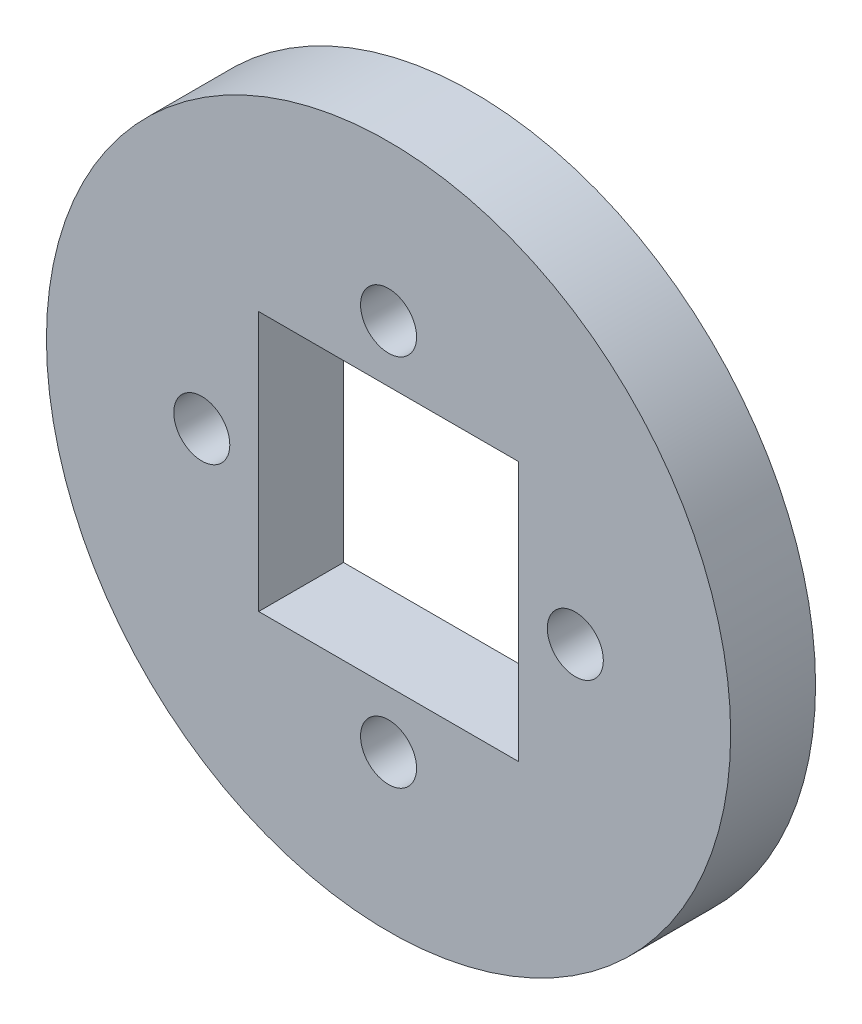
ISO-10303-21;
HEADER;
FILE_DESCRIPTION(('STEP AP214'),'2;1');
FILE_NAME('part.step','',(''),(''),'','','');
FILE_SCHEMA(('AUTOMOTIVE_DESIGN { 1 0 10303 214 1 1 1 1 }'));
ENDSEC;
DATA;
#1=APPLICATION_CONTEXT('core data for automotive mechanical design processes');
#2=APPLICATION_PROTOCOL_DEFINITION('international standard','automotive_design',2000,#1);
#3=PRODUCT_CONTEXT('',#1,'mechanical');
#4=PRODUCT('Part','Part','',(#3));
#5=PRODUCT_RELATED_PRODUCT_CATEGORY('part','',(#4));
#6=PRODUCT_DEFINITION_FORMATION('','',#4);
#7=PRODUCT_DEFINITION_CONTEXT('part definition',#1,'design');
#8=PRODUCT_DEFINITION('design','',#6,#7);
#9=PRODUCT_DEFINITION_SHAPE('','',#8);
#10=(LENGTH_UNIT() NAMED_UNIT(*) SI_UNIT(.MILLI.,.METRE.));
#11=(NAMED_UNIT(*) PLANE_ANGLE_UNIT() SI_UNIT($,.RADIAN.));
#12=(NAMED_UNIT(*) SI_UNIT($,.STERADIAN.) SOLID_ANGLE_UNIT());
#13=UNCERTAINTY_MEASURE_WITH_UNIT(LENGTH_MEASURE(1.E-05),#10,'distance_accuracy_value','');
#14=(GEOMETRIC_REPRESENTATION_CONTEXT(3) GLOBAL_UNCERTAINTY_ASSIGNED_CONTEXT((#13)) GLOBAL_UNIT_ASSIGNED_CONTEXT((#10,
#11,#12)) REPRESENTATION_CONTEXT('',''));
#15=CARTESIAN_POINT('',(0.,0.,0.));
#16=DIRECTION('',(0.,0.,1.));
#17=DIRECTION('',(1.,0.,0.));
#18=AXIS2_PLACEMENT_3D('',#15,#16,#17);
#19=CARTESIAN_POINT('',(-6.10893576505987E-13,22.0000000000008,10.));
#20=DIRECTION('',(0.,0.,-1.));
#21=DIRECTION('',(-1.,0.,0.));
#22=AXIS2_PLACEMENT_3D('',#19,#20,#21);
#23=CYLINDRICAL_SURFACE('',#22,1.65000000000054);
#24=CARTESIAN_POINT('',(-6.10893576505987E-13,22.0000000000008,0.));
#25=DIRECTION('',(0.,0.,1.));
#26=DIRECTION('',(1.,0.,0.));
#27=AXIS2_PLACEMENT_3D('',#24,#25,#26);
#28=CIRCLE('',#27,1.65000000000054);
#29=CARTESIAN_POINT('',(1.64999999999993,22.0000000000008,0.));
#30=VERTEX_POINT('',#29);
#31=EDGE_CURVE('E108',#30,#30,#28,.T.);
#32=ORIENTED_EDGE('',*,*,#31,.F.);
#33=EDGE_LOOP('',(#32));
#34=FACE_BOUND('',#33,.T.);
#35=CARTESIAN_POINT('',(-6.10893576505987E-13,22.0000000000008,4.));
#36=DIRECTION('',(0.,0.,1.));
#37=DIRECTION('',(1.,0.,0.));
#38=AXIS2_PLACEMENT_3D('',#35,#36,#37);
#39=CIRCLE('',#38,1.65000000000054);
#40=CARTESIAN_POINT('',(1.64999999999993,22.0000000000008,4.));
#41=VERTEX_POINT('',#40);
#42=EDGE_CURVE('E41',#41,#41,#39,.T.);
#43=ORIENTED_EDGE('',*,*,#42,.T.);
#44=EDGE_LOOP('',(#43));
#45=FACE_BOUND('',#44,.T.);
#46=ADVANCED_FACE('F37',(#34,#45),#23,.F.);
#47=CARTESIAN_POINT('',(21.9999999999991,7.89137852286181E-13,10.));
#48=DIRECTION('',(0.,0.,-1.));
#49=DIRECTION('',(-1.,0.,0.));
#50=AXIS2_PLACEMENT_3D('',#47,#48,#49);
#51=CYLINDRICAL_SURFACE('',#50,1.65000000000057);
#52=CARTESIAN_POINT('',(21.9999999999991,7.89137852286181E-13,0.));
#53=DIRECTION('',(0.,0.,1.));
#54=DIRECTION('',(1.,0.,0.));
#55=AXIS2_PLACEMENT_3D('',#52,#53,#54);
#56=CIRCLE('',#55,1.65000000000057);
#57=CARTESIAN_POINT('',(23.6499999999997,7.89137852286181E-13,0.));
#58=VERTEX_POINT('',#57);
#59=EDGE_CURVE('E140',#58,#58,#56,.T.);
#60=ORIENTED_EDGE('',*,*,#59,.F.);
#61=EDGE_LOOP('',(#60));
#62=FACE_BOUND('',#61,.T.);
#63=CARTESIAN_POINT('',(21.9999999999991,7.89137852286181E-13,4.));
#64=DIRECTION('',(0.,0.,1.));
#65=DIRECTION('',(1.,0.,0.));
#66=AXIS2_PLACEMENT_3D('',#63,#64,#65);
#67=CIRCLE('',#66,1.65000000000057);
#68=CARTESIAN_POINT('',(23.6499999999997,7.89137852286181E-13,4.));
#69=VERTEX_POINT('',#68);
#70=EDGE_CURVE('E126',#69,#69,#67,.T.);
#71=ORIENTED_EDGE('',*,*,#70,.T.);
#72=EDGE_LOOP('',(#71));
#73=FACE_BOUND('',#72,.T.);
#74=ADVANCED_FACE('F154',(#62,#73),#51,.F.);
#75=CARTESIAN_POINT('',(-9.59666275445163E-13,-21.9999999999992,10.));
#76=DIRECTION('',(0.,0.,-1.));
#77=DIRECTION('',(-1.,0.,0.));
#78=AXIS2_PLACEMENT_3D('',#75,#76,#77);
#79=CYLINDRICAL_SURFACE('',#78,1.65000000000059);
#80=CARTESIAN_POINT('',(-9.59666275445163E-13,-21.9999999999992,0.));
#81=DIRECTION('',(0.,0.,1.));
#82=DIRECTION('',(1.,0.,0.));
#83=AXIS2_PLACEMENT_3D('',#80,#81,#82);
#84=CIRCLE('',#83,1.65000000000059);
#85=CARTESIAN_POINT('',(1.64999999999963,-21.9999999999992,0.));
#86=VERTEX_POINT('',#85);
#87=EDGE_CURVE('E135',#86,#86,#84,.T.);
#88=ORIENTED_EDGE('',*,*,#87,.F.);
#89=EDGE_LOOP('',(#88));
#90=FACE_BOUND('',#89,.T.);
#91=CARTESIAN_POINT('',(-9.59666275445163E-13,-21.9999999999992,4.));
#92=DIRECTION('',(0.,0.,1.));
#93=DIRECTION('',(1.,0.,0.));
#94=AXIS2_PLACEMENT_3D('',#91,#92,#93);
#95=CIRCLE('',#94,1.65000000000059);
#96=CARTESIAN_POINT('',(1.64999999999963,-21.9999999999992,4.));
#97=VERTEX_POINT('',#96);
#98=EDGE_CURVE('E123',#97,#97,#95,.T.);
#99=ORIENTED_EDGE('',*,*,#98,.T.);
#100=EDGE_LOOP('',(#99));
#101=FACE_BOUND('',#100,.T.);
#102=ADVANCED_FACE('F159',(#90,#101),#79,.F.);
#103=CARTESIAN_POINT('',(-22.0000000000009,9.8428537231626E-13,10.));
#104=DIRECTION('',(0.,0.,-1.));
#105=DIRECTION('',(-1.,0.,0.));
#106=AXIS2_PLACEMENT_3D('',#103,#104,#105);
#107=CYLINDRICAL_SURFACE('',#106,1.65000000000055);
#108=CARTESIAN_POINT('',(-22.0000000000009,9.8428537231626E-13,0.));
#109=DIRECTION('',(0.,0.,1.));
#110=DIRECTION('',(1.,0.,0.));
#111=AXIS2_PLACEMENT_3D('',#108,#109,#110);
#112=CIRCLE('',#111,1.65000000000055);
#113=CARTESIAN_POINT('',(-20.3500000000003,9.8428537231626E-13,0.));
#114=VERTEX_POINT('',#113);
#115=EDGE_CURVE('E131',#114,#114,#112,.T.);
#116=ORIENTED_EDGE('',*,*,#115,.F.);
#117=EDGE_LOOP('',(#116));
#118=FACE_BOUND('',#117,.T.);
#119=CARTESIAN_POINT('',(-22.0000000000009,9.8428537231626E-13,4.));
#120=DIRECTION('',(0.,0.,1.));
#121=DIRECTION('',(1.,0.,0.));
#122=AXIS2_PLACEMENT_3D('',#119,#120,#121);
#123=CIRCLE('',#122,1.65000000000055);
#124=CARTESIAN_POINT('',(-20.3500000000003,9.8428537231626E-13,4.));
#125=VERTEX_POINT('',#124);
#126=EDGE_CURVE('E120',#125,#125,#123,.T.);
#127=ORIENTED_EDGE('',*,*,#126,.T.);
#128=EDGE_LOOP('',(#127));
#129=FACE_BOUND('',#128,.T.);
#130=ADVANCED_FACE('F177',(#118,#129),#107,.F.);
#131=CARTESIAN_POINT('',(-3.88578058618805E-13,0.,10.));
#132=DIRECTION('',(0.,0.,1.));
#133=DIRECTION('',(1.,0.,0.));
#134=AXIS2_PLACEMENT_3D('',#131,#132,#133);
#135=PLANE('',#134);
#136=CARTESIAN_POINT('',(21.9999999999991,7.89137852286181E-13,10.));
#137=DIRECTION('',(0.,0.,1.));
#138=DIRECTION('',(1.,0.,0.));
#139=AXIS2_PLACEMENT_3D('',#136,#137,#138);
#140=CIRCLE('',#139,3.30000000000057);
#141=CARTESIAN_POINT('',(25.2999999999997,7.89137852286181E-13,10.));
#142=VERTEX_POINT('',#141);
#143=EDGE_CURVE('E394',#142,#142,#140,.T.);
#144=ORIENTED_EDGE('',*,*,#143,.F.);
#145=EDGE_LOOP('',(#144));
#146=FACE_BOUND('',#145,.T.);
#147=CARTESIAN_POINT('',(-6.10893576505987E-13,22.0000000000008,10.));
#148=DIRECTION('',(0.,0.,1.));
#149=DIRECTION('',(1.,0.,0.));
#150=AXIS2_PLACEMENT_3D('',#147,#148,#149);
#151=CIRCLE('',#150,3.30000000000055);
#152=CARTESIAN_POINT('',(3.29999999999993,22.0000000000008,10.));
#153=VERTEX_POINT('',#152);
#154=EDGE_CURVE('E391',#153,#153,#151,.T.);
#155=ORIENTED_EDGE('',*,*,#154,.F.);
#156=EDGE_LOOP('',(#155));
#157=FACE_BOUND('',#156,.T.);
#158=CARTESIAN_POINT('',(-22.0000000000009,9.8428537231626E-13,10.));
#159=DIRECTION('',(0.,0.,1.));
#160=DIRECTION('',(1.,0.,0.));
#161=AXIS2_PLACEMENT_3D('',#158,#159,#160);
#162=CIRCLE('',#161,3.30000000000056);
#163=CARTESIAN_POINT('',(-18.7000000000003,9.8428537231626E-13,10.));
#164=VERTEX_POINT('',#163);
#165=EDGE_CURVE('E381',#164,#164,#162,.T.);
#166=ORIENTED_EDGE('',*,*,#165,.F.);
#167=EDGE_LOOP('',(#166));
#168=FACE_BOUND('',#167,.T.);
#169=CARTESIAN_POINT('',(-9.59666275445163E-13,-21.9999999999992,10.));
#170=DIRECTION('',(0.,0.,1.));
#171=DIRECTION('',(1.,0.,0.));
#172=AXIS2_PLACEMENT_3D('',#169,#170,#171);
#173=CIRCLE('',#172,3.30000000000059);
#174=CARTESIAN_POINT('',(3.29999999999963,-21.9999999999992,10.));
#175=VERTEX_POINT('',#174);
#176=EDGE_CURVE('E382',#175,#175,#173,.T.);
#177=ORIENTED_EDGE('',*,*,#176,.F.);
#178=EDGE_LOOP('',(#177));
#179=FACE_BOUND('',#178,.T.);
#180=CARTESIAN_POINT('',(-3.88578058618805E-13,0.,10.));
#181=DIRECTION('',(0.,0.,1.));
#182=DIRECTION('',(1.,0.,0.));
#183=AXIS2_PLACEMENT_3D('',#180,#181,#182);
#184=CIRCLE('',#183,40.3000000000004);
#185=CARTESIAN_POINT('',(40.3,0.,10.));
#186=VERTEX_POINT('',#185);
#187=EDGE_CURVE('E11',#186,#186,#184,.T.);
#188=ORIENTED_EDGE('',*,*,#187,.T.);
#189=EDGE_LOOP('',(#188));
#190=FACE_BOUND('',#189,.T.);
#191=DIRECTION('',(0.,-1.,0.));
#192=VECTOR('',#191,1.);
#193=CARTESIAN_POINT('',(-15.3000000000009,15.3000000000008,10.));
#194=LINE('',#193,#192);
#195=CARTESIAN_POINT('',(-15.3000000000009,15.3000000000008,10.));
#196=VERTEX_POINT('',#195);
#197=CARTESIAN_POINT('',(-15.3000000000009,-15.2999999999992,10.));
#198=VERTEX_POINT('',#197);
#199=EDGE_CURVE('E88',#196,#198,#194,.T.);
#200=ORIENTED_EDGE('',*,*,#199,.F.);
#201=DIRECTION('',(-1.,0.,0.));
#202=VECTOR('',#201,1.);
#203=CARTESIAN_POINT('',(15.2999999999991,15.3000000000008,10.));
#204=LINE('',#203,#202);
#205=CARTESIAN_POINT('',(15.2999999999991,15.3000000000008,10.));
#206=VERTEX_POINT('',#205);
#207=EDGE_CURVE('E80',#206,#196,#204,.T.);
#208=ORIENTED_EDGE('',*,*,#207,.F.);
#209=DIRECTION('',(0.,1.,0.));
#210=VECTOR('',#209,1.);
#211=CARTESIAN_POINT('',(15.2999999999991,-15.2999999999992,10.));
#212=LINE('',#211,#210);
#213=CARTESIAN_POINT('',(15.2999999999991,-15.2999999999992,10.));
#214=VERTEX_POINT('',#213);
#215=EDGE_CURVE('E102',#214,#206,#212,.T.);
#216=ORIENTED_EDGE('',*,*,#215,.F.);
#217=DIRECTION('',(1.,0.,0.));
#218=VECTOR('',#217,1.);
#219=CARTESIAN_POINT('',(-15.3000000000009,-15.2999999999992,10.));
#220=LINE('',#219,#218);
#221=EDGE_CURVE('E100',#198,#214,#220,.T.);
#222=ORIENTED_EDGE('',*,*,#221,.F.);
#223=EDGE_LOOP('',(#200,#208,#216,#222));
#224=FACE_BOUND('',#223,.T.);
#225=ADVANCED_FACE('F99',(#146,#157,#168,#179,#190,#224),#135,.T.);
#226=CARTESIAN_POINT('',(-3.88578058618805E-13,0.,0.));
#227=DIRECTION('',(0.,0.,1.));
#228=DIRECTION('',(1.,0.,0.));
#229=AXIS2_PLACEMENT_3D('',#226,#227,#228);
#230=PLANE('',#229);
#231=CARTESIAN_POINT('',(-3.88578058618805E-13,0.,0.));
#232=DIRECTION('',(0.,0.,1.));
#233=DIRECTION('',(1.,0.,0.));
#234=AXIS2_PLACEMENT_3D('',#231,#232,#233);
#235=CIRCLE('',#234,40.3000000000004);
#236=CARTESIAN_POINT('',(40.3,0.,0.));
#237=VERTEX_POINT('',#236);
#238=EDGE_CURVE('E46',#237,#237,#235,.T.);
#239=ORIENTED_EDGE('',*,*,#238,.F.);
#240=EDGE_LOOP('',(#239));
#241=FACE_BOUND('',#240,.T.);
#242=DIRECTION('',(-1.,0.,0.));
#243=VECTOR('',#242,1.);
#244=CARTESIAN_POINT('',(15.2999999999991,15.3000000000008,0.));
#245=LINE('',#244,#243);
#246=CARTESIAN_POINT('',(15.2999999999991,15.3000000000008,0.));
#247=VERTEX_POINT('',#246);
#248=CARTESIAN_POINT('',(-15.3000000000009,15.3000000000008,0.));
#249=VERTEX_POINT('',#248);
#250=EDGE_CURVE('E62',#247,#249,#245,.T.);
#251=ORIENTED_EDGE('',*,*,#250,.T.);
#252=DIRECTION('',(0.,-1.,0.));
#253=VECTOR('',#252,1.);
#254=CARTESIAN_POINT('',(-15.3000000000009,15.3000000000008,0.));
#255=LINE('',#254,#253);
#256=CARTESIAN_POINT('',(-15.3000000000009,-15.2999999999992,0.));
#257=VERTEX_POINT('',#256);
#258=EDGE_CURVE('E95',#249,#257,#255,.T.);
#259=ORIENTED_EDGE('',*,*,#258,.T.);
#260=DIRECTION('',(1.,0.,0.));
#261=VECTOR('',#260,1.);
#262=CARTESIAN_POINT('',(-15.3000000000009,-15.2999999999992,0.));
#263=LINE('',#262,#261);
#264=CARTESIAN_POINT('',(15.2999999999991,-15.2999999999992,0.));
#265=VERTEX_POINT('',#264);
#266=EDGE_CURVE('E110',#257,#265,#263,.T.);
#267=ORIENTED_EDGE('',*,*,#266,.T.);
#268=DIRECTION('',(0.,1.,0.));
#269=VECTOR('',#268,1.);
#270=CARTESIAN_POINT('',(15.2999999999991,-15.2999999999992,0.));
#271=LINE('',#270,#269);
#272=EDGE_CURVE('E89',#265,#247,#271,.T.);
#273=ORIENTED_EDGE('',*,*,#272,.T.);
#274=EDGE_LOOP('',(#251,#259,#267,#273));
#275=FACE_BOUND('',#274,.T.);
#276=ORIENTED_EDGE('',*,*,#31,.T.);
#277=EDGE_LOOP('',(#276));
#278=FACE_BOUND('',#277,.T.);
#279=ORIENTED_EDGE('',*,*,#59,.T.);
#280=EDGE_LOOP('',(#279));
#281=FACE_BOUND('',#280,.T.);
#282=ORIENTED_EDGE('',*,*,#87,.T.);
#283=EDGE_LOOP('',(#282));
#284=FACE_BOUND('',#283,.T.);
#285=ORIENTED_EDGE('',*,*,#115,.T.);
#286=EDGE_LOOP('',(#285));
#287=FACE_BOUND('',#286,.T.);
#288=ADVANCED_FACE('F150',(#241,#275,#278,#281,#284,#287),#230,.F.);
#289=CARTESIAN_POINT('',(-3.88578058618805E-13,0.,10.));
#290=DIRECTION('',(0.,0.,-1.));
#291=DIRECTION('',(-1.,0.,0.));
#292=AXIS2_PLACEMENT_3D('',#289,#290,#291);
#293=CYLINDRICAL_SURFACE('',#292,40.3000000000004);
#294=ORIENTED_EDGE('',*,*,#187,.F.);
#295=EDGE_LOOP('',(#294));
#296=FACE_BOUND('',#295,.T.);
#297=ORIENTED_EDGE('',*,*,#238,.T.);
#298=EDGE_LOOP('',(#297));
#299=FACE_BOUND('',#298,.T.);
#300=ADVANCED_FACE('F39',(#296,#299),#293,.T.);
#301=CARTESIAN_POINT('',(15.2999999999991,15.3000000000008,10.));
#302=DIRECTION('',(0.,-1.,0.));
#303=DIRECTION('',(1.,0.,0.));
#304=AXIS2_PLACEMENT_3D('',#301,#302,#303);
#305=PLANE('',#304);
#306=ORIENTED_EDGE('',*,*,#250,.F.);
#307=DIRECTION('',(0.,0.,-1.));
#308=VECTOR('',#307,1.);
#309=CARTESIAN_POINT('',(15.2999999999991,15.3000000000008,10.));
#310=LINE('',#309,#308);
#311=EDGE_CURVE('E84',#206,#247,#310,.T.);
#312=ORIENTED_EDGE('',*,*,#311,.F.);
#313=ORIENTED_EDGE('',*,*,#207,.T.);
#314=DIRECTION('',(0.,0.,-1.));
#315=VECTOR('',#314,1.);
#316=CARTESIAN_POINT('',(-15.3000000000009,15.3000000000008,10.));
#317=LINE('',#316,#315);
#318=EDGE_CURVE('E83',#196,#249,#317,.T.);
#319=ORIENTED_EDGE('',*,*,#318,.T.);
#320=EDGE_LOOP('',(#306,#312,#313,#319));
#321=FACE_BOUND('',#320,.T.);
#322=ADVANCED_FACE('F82',(#321),#305,.T.);
#323=CARTESIAN_POINT('',(-15.3000000000009,15.3000000000008,10.));
#324=DIRECTION('',(1.,0.,0.));
#325=DIRECTION('',(0.,1.,0.));
#326=AXIS2_PLACEMENT_3D('',#323,#324,#325);
#327=PLANE('',#326);
#328=ORIENTED_EDGE('',*,*,#258,.F.);
#329=ORIENTED_EDGE('',*,*,#318,.F.);
#330=ORIENTED_EDGE('',*,*,#199,.T.);
#331=DIRECTION('',(0.,0.,-1.));
#332=VECTOR('',#331,1.);
#333=CARTESIAN_POINT('',(-15.3000000000009,-15.2999999999992,10.));
#334=LINE('',#333,#332);
#335=EDGE_CURVE('E96',#198,#257,#334,.T.);
#336=ORIENTED_EDGE('',*,*,#335,.T.);
#337=EDGE_LOOP('',(#328,#329,#330,#336));
#338=FACE_BOUND('',#337,.T.);
#339=ADVANCED_FACE('F92',(#338),#327,.T.);
#340=CARTESIAN_POINT('',(-15.3000000000009,-15.2999999999992,10.));
#341=DIRECTION('',(0.,1.,0.));
#342=DIRECTION('',(-1.,0.,0.));
#343=AXIS2_PLACEMENT_3D('',#340,#341,#342);
#344=PLANE('',#343);
#345=ORIENTED_EDGE('',*,*,#266,.F.);
#346=ORIENTED_EDGE('',*,*,#335,.F.);
#347=ORIENTED_EDGE('',*,*,#221,.T.);
#348=DIRECTION('',(0.,0.,-1.));
#349=VECTOR('',#348,1.);
#350=CARTESIAN_POINT('',(15.2999999999991,-15.2999999999992,10.));
#351=LINE('',#350,#349);
#352=EDGE_CURVE('E54',#214,#265,#351,.T.);
#353=ORIENTED_EDGE('',*,*,#352,.T.);
#354=EDGE_LOOP('',(#345,#346,#347,#353));
#355=FACE_BOUND('',#354,.T.);
#356=ADVANCED_FACE('F168',(#355),#344,.T.);
#357=CARTESIAN_POINT('',(15.2999999999991,-15.2999999999992,10.));
#358=DIRECTION('',(-1.,0.,0.));
#359=DIRECTION('',(0.,-1.,0.));
#360=AXIS2_PLACEMENT_3D('',#357,#358,#359);
#361=PLANE('',#360);
#362=ORIENTED_EDGE('',*,*,#272,.F.);
#363=ORIENTED_EDGE('',*,*,#352,.F.);
#364=ORIENTED_EDGE('',*,*,#215,.T.);
#365=ORIENTED_EDGE('',*,*,#311,.T.);
#366=EDGE_LOOP('',(#362,#363,#364,#365));
#367=FACE_BOUND('',#366,.T.);
#368=ADVANCED_FACE('F164',(#367),#361,.T.);
#369=CARTESIAN_POINT('',(-22.0000000000009,9.8428537231626E-13,4.));
#370=DIRECTION('',(0.,0.,1.));
#371=DIRECTION('',(1.,0.,0.));
#372=AXIS2_PLACEMENT_3D('',#369,#370,#371);
#373=CYLINDRICAL_SURFACE('',#372,3.30000000000056);
#374=CARTESIAN_POINT('',(-22.0000000000009,9.8428537231626E-13,4.));
#375=DIRECTION('',(0.,0.,1.));
#376=DIRECTION('',(1.,0.,0.));
#377=AXIS2_PLACEMENT_3D('',#374,#375,#376);
#378=CIRCLE('',#377,3.30000000000056);
#379=CARTESIAN_POINT('',(-18.7000000000003,9.8428537231626E-13,4.));
#380=VERTEX_POINT('',#379);
#381=EDGE_CURVE('E380',#380,#380,#378,.T.);
#382=ORIENTED_EDGE('',*,*,#381,.F.);
#383=EDGE_LOOP('',(#382));
#384=FACE_BOUND('',#383,.T.);
#385=ORIENTED_EDGE('',*,*,#165,.T.);
#386=EDGE_LOOP('',(#385));
#387=FACE_BOUND('',#386,.T.);
#388=ADVANCED_FACE('F167',(#384,#387),#373,.F.);
#389=CARTESIAN_POINT('',(-22.0000000000009,9.8428537231626E-13,4.));
#390=DIRECTION('',(0.,0.,1.));
#391=DIRECTION('',(1.,0.,0.));
#392=AXIS2_PLACEMENT_3D('',#389,#390,#391);
#393=PLANE('',#392);
#394=ORIENTED_EDGE('',*,*,#126,.F.);
#395=EDGE_LOOP('',(#394));
#396=FACE_BOUND('',#395,.T.);
#397=ORIENTED_EDGE('',*,*,#381,.T.);
#398=EDGE_LOOP('',(#397));
#399=FACE_BOUND('',#398,.T.);
#400=ADVANCED_FACE('F215',(#396,#399),#393,.T.);
#401=CARTESIAN_POINT('',(-9.59666275445163E-13,-21.9999999999992,4.));
#402=DIRECTION('',(0.,0.,1.));
#403=DIRECTION('',(1.,0.,0.));
#404=AXIS2_PLACEMENT_3D('',#401,#402,#403);
#405=CYLINDRICAL_SURFACE('',#404,3.30000000000059);
#406=CARTESIAN_POINT('',(-9.59666275445163E-13,-21.9999999999992,4.));
#407=DIRECTION('',(0.,0.,1.));
#408=DIRECTION('',(1.,0.,0.));
#409=AXIS2_PLACEMENT_3D('',#406,#407,#408);
#410=CIRCLE('',#409,3.30000000000059);
#411=CARTESIAN_POINT('',(3.29999999999963,-21.9999999999992,4.));
#412=VERTEX_POINT('',#411);
#413=EDGE_CURVE('E143',#412,#412,#410,.T.);
#414=ORIENTED_EDGE('',*,*,#413,.F.);
#415=EDGE_LOOP('',(#414));
#416=FACE_BOUND('',#415,.T.);
#417=ORIENTED_EDGE('',*,*,#176,.T.);
#418=EDGE_LOOP('',(#417));
#419=FACE_BOUND('',#418,.T.);
#420=ADVANCED_FACE('F224',(#416,#419),#405,.F.);
#421=CARTESIAN_POINT('',(-9.59666275445163E-13,-21.9999999999992,4.));
#422=DIRECTION('',(0.,0.,1.));
#423=DIRECTION('',(1.,0.,0.));
#424=AXIS2_PLACEMENT_3D('',#421,#422,#423);
#425=PLANE('',#424);
#426=ORIENTED_EDGE('',*,*,#98,.F.);
#427=EDGE_LOOP('',(#426));
#428=FACE_BOUND('',#427,.T.);
#429=ORIENTED_EDGE('',*,*,#413,.T.);
#430=EDGE_LOOP('',(#429));
#431=FACE_BOUND('',#430,.T.);
#432=ADVANCED_FACE('F232',(#428,#431),#425,.T.);
#433=CARTESIAN_POINT('',(21.9999999999991,7.89137852286181E-13,4.));
#434=DIRECTION('',(0.,0.,1.));
#435=DIRECTION('',(1.,0.,0.));
#436=AXIS2_PLACEMENT_3D('',#433,#434,#435);
#437=CYLINDRICAL_SURFACE('',#436,3.30000000000057);
#438=CARTESIAN_POINT('',(21.9999999999991,7.89137852286181E-13,4.));
#439=DIRECTION('',(0.,0.,1.));
#440=DIRECTION('',(1.,0.,0.));
#441=AXIS2_PLACEMENT_3D('',#438,#439,#440);
#442=CIRCLE('',#441,3.30000000000057);
#443=CARTESIAN_POINT('',(25.2999999999997,7.89137852286181E-13,4.));
#444=VERTEX_POINT('',#443);
#445=EDGE_CURVE('E124',#444,#444,#442,.T.);
#446=ORIENTED_EDGE('',*,*,#445,.F.);
#447=EDGE_LOOP('',(#446));
#448=FACE_BOUND('',#447,.T.);
#449=ORIENTED_EDGE('',*,*,#143,.T.);
#450=EDGE_LOOP('',(#449));
#451=FACE_BOUND('',#450,.T.);
#452=ADVANCED_FACE('F240',(#448,#451),#437,.F.);
#453=CARTESIAN_POINT('',(21.9999999999991,7.89137852286181E-13,4.));
#454=DIRECTION('',(0.,0.,1.));
#455=DIRECTION('',(1.,0.,0.));
#456=AXIS2_PLACEMENT_3D('',#453,#454,#455);
#457=PLANE('',#456);
#458=ORIENTED_EDGE('',*,*,#70,.F.);
#459=EDGE_LOOP('',(#458));
#460=FACE_BOUND('',#459,.T.);
#461=ORIENTED_EDGE('',*,*,#445,.T.);
#462=EDGE_LOOP('',(#461));
#463=FACE_BOUND('',#462,.T.);
#464=ADVANCED_FACE('F248',(#460,#463),#457,.T.);
#465=CARTESIAN_POINT('',(-6.10893576505987E-13,22.0000000000008,4.));
#466=DIRECTION('',(0.,0.,1.));
#467=DIRECTION('',(1.,0.,0.));
#468=AXIS2_PLACEMENT_3D('',#465,#466,#467);
#469=CYLINDRICAL_SURFACE('',#468,3.30000000000055);
#470=CARTESIAN_POINT('',(-6.10893576505987E-13,22.0000000000008,4.));
#471=DIRECTION('',(0.,0.,1.));
#472=DIRECTION('',(1.,0.,0.));
#473=AXIS2_PLACEMENT_3D('',#470,#471,#472);
#474=CIRCLE('',#473,3.30000000000055);
#475=CARTESIAN_POINT('',(3.29999999999993,22.0000000000008,4.));
#476=VERTEX_POINT('',#475);
#477=EDGE_CURVE('E385',#476,#476,#474,.T.);
#478=ORIENTED_EDGE('',*,*,#477,.F.);
#479=EDGE_LOOP('',(#478));
#480=FACE_BOUND('',#479,.T.);
#481=ORIENTED_EDGE('',*,*,#154,.T.);
#482=EDGE_LOOP('',(#481));
#483=FACE_BOUND('',#482,.T.);
#484=ADVANCED_FACE('F256',(#480,#483),#469,.F.);
#485=CARTESIAN_POINT('',(-6.10893576505987E-13,22.0000000000008,4.));
#486=DIRECTION('',(0.,0.,1.));
#487=DIRECTION('',(1.,0.,0.));
#488=AXIS2_PLACEMENT_3D('',#485,#486,#487);
#489=PLANE('',#488);
#490=ORIENTED_EDGE('',*,*,#42,.F.);
#491=EDGE_LOOP('',(#490));
#492=FACE_BOUND('',#491,.T.);
#493=ORIENTED_EDGE('',*,*,#477,.T.);
#494=EDGE_LOOP('',(#493));
#495=FACE_BOUND('',#494,.T.);
#496=ADVANCED_FACE('F264',(#492,#495),#489,.T.);
#497=CLOSED_SHELL('',(#46,#74,#102,#130,#225,#288,#300,#322,#339,#356,#368,#388,#400,#420,#432,
#452,#464,#484,#496));
#498=MANIFOLD_SOLID_BREP('B2',#497);
#499=ADVANCED_BREP_SHAPE_REPRESENTATION('',(#18,#498),#14);
#500=SHAPE_DEFINITION_REPRESENTATION(#9,#499);
ENDSEC;
END-ISO-10303-21;
